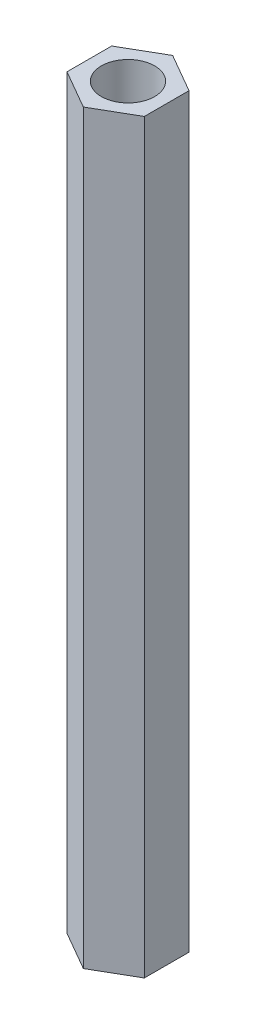
ISO-10303-21;
HEADER;
FILE_DESCRIPTION(('STEP AP214'),'2;1');
FILE_NAME('part.step','',(''),(''),'','','');
FILE_SCHEMA(('AUTOMOTIVE_DESIGN { 1 0 10303 214 1 1 1 1 }'));
ENDSEC;
DATA;
#1=APPLICATION_CONTEXT('core data for automotive mechanical design processes');
#2=APPLICATION_PROTOCOL_DEFINITION('international standard','automotive_design',2000,#1);
#3=PRODUCT_CONTEXT('',#1,'mechanical');
#4=PRODUCT('Part','Part','',(#3));
#5=PRODUCT_RELATED_PRODUCT_CATEGORY('part','',(#4));
#6=PRODUCT_DEFINITION_FORMATION('','',#4);
#7=PRODUCT_DEFINITION_CONTEXT('part definition',#1,'design');
#8=PRODUCT_DEFINITION('design','',#6,#7);
#9=PRODUCT_DEFINITION_SHAPE('','',#8);
#10=(LENGTH_UNIT() NAMED_UNIT(*) SI_UNIT(.MILLI.,.METRE.));
#11=(NAMED_UNIT(*) PLANE_ANGLE_UNIT() SI_UNIT($,.RADIAN.));
#12=(NAMED_UNIT(*) SI_UNIT($,.STERADIAN.) SOLID_ANGLE_UNIT());
#13=UNCERTAINTY_MEASURE_WITH_UNIT(LENGTH_MEASURE(1.E-05),#10,'distance_accuracy_value','');
#14=(GEOMETRIC_REPRESENTATION_CONTEXT(3) GLOBAL_UNCERTAINTY_ASSIGNED_CONTEXT((#13)) GLOBAL_UNIT_ASSIGNED_CONTEXT((#10,
#11,#12)) REPRESENTATION_CONTEXT('',''));
#15=CARTESIAN_POINT('',(0.,0.,0.));
#16=DIRECTION('',(0.,0.,1.));
#17=DIRECTION('',(1.,0.,0.));
#18=AXIS2_PLACEMENT_3D('',#15,#16,#17);
#19=CARTESIAN_POINT('',(0.,42.,0.));
#20=DIRECTION('',(0.,1.,0.));
#21=DIRECTION('',(0.,0.,1.));
#22=AXIS2_PLACEMENT_3D('',#19,#20,#21);
#23=PLANE('',#22);
#24=DIRECTION('',(-0.866025403784439,0.,-0.5));
#25=VECTOR('',#24,1.);
#26=CARTESIAN_POINT('',(2.1771024388365,42.,-1.25695067911564));
#27=LINE('',#26,#25);
#28=CARTESIAN_POINT('',(2.1771024388365,42.,-1.25695067911564));
#29=VERTEX_POINT('',#28);
#30=CARTESIAN_POINT('',(0.,42.,-2.51390135823129));
#31=VERTEX_POINT('',#30);
#32=EDGE_CURVE('E131',#29,#31,#27,.T.);
#33=ORIENTED_EDGE('',*,*,#32,.T.);
#34=DIRECTION('',(-0.866025403784439,0.,0.5));
#35=VECTOR('',#34,1.);
#36=CARTESIAN_POINT('',(0.,42.,-2.51390135823129));
#37=LINE('',#36,#35);
#38=CARTESIAN_POINT('',(-2.1771024388365,42.,-1.25695067911564));
#39=VERTEX_POINT('',#38);
#40=EDGE_CURVE('E89',#31,#39,#37,.T.);
#41=ORIENTED_EDGE('',*,*,#40,.T.);
#42=DIRECTION('',(0.,0.,1.));
#43=VECTOR('',#42,1.);
#44=CARTESIAN_POINT('',(-2.1771024388365,42.,-1.25695067911564));
#45=LINE('',#44,#43);
#46=CARTESIAN_POINT('',(-2.1771024388365,42.,1.25695067911564));
#47=VERTEX_POINT('',#46);
#48=EDGE_CURVE('E102',#39,#47,#45,.T.);
#49=ORIENTED_EDGE('',*,*,#48,.T.);
#50=DIRECTION('',(0.866025403784439,0.,0.5));
#51=VECTOR('',#50,1.);
#52=CARTESIAN_POINT('',(-2.1771024388365,42.,1.25695067911564));
#53=LINE('',#52,#51);
#54=CARTESIAN_POINT('',(0.,42.,2.51390135823129));
#55=VERTEX_POINT('',#54);
#56=EDGE_CURVE('E96',#47,#55,#53,.T.);
#57=ORIENTED_EDGE('',*,*,#56,.T.);
#58=DIRECTION('',(0.866025403784439,0.,-0.5));
#59=VECTOR('',#58,1.);
#60=CARTESIAN_POINT('',(0.,42.,2.51390135823129));
#61=LINE('',#60,#59);
#62=CARTESIAN_POINT('',(2.1771024388365,42.,1.25695067911564));
#63=VERTEX_POINT('',#62);
#64=EDGE_CURVE('E100',#55,#63,#61,.T.);
#65=ORIENTED_EDGE('',*,*,#64,.T.);
#66=DIRECTION('',(0.,0.,-1.));
#67=VECTOR('',#66,1.);
#68=CARTESIAN_POINT('',(2.1771024388365,42.,1.25695067911564));
#69=LINE('',#68,#67);
#70=EDGE_CURVE('E52',#63,#29,#69,.T.);
#71=ORIENTED_EDGE('',*,*,#70,.T.);
#72=EDGE_LOOP('',(#33,#41,#49,#57,#65,#71));
#73=FACE_BOUND('',#72,.T.);
#74=CARTESIAN_POINT('',(0.,42.,0.));
#75=DIRECTION('',(0.,1.,0.));
#76=DIRECTION('',(0.,0.,1.));
#77=AXIS2_PLACEMENT_3D('',#74,#75,#76);
#78=CIRCLE('',#77,1.5);
#79=CARTESIAN_POINT('',(0.,42.,-1.5));
#80=VERTEX_POINT('',#79);
#81=EDGE_CURVE('E124',#80,#80,#78,.T.);
#82=ORIENTED_EDGE('',*,*,#81,.F.);
#83=EDGE_LOOP('',(#82));
#84=FACE_BOUND('',#83,.T.);
#85=ADVANCED_FACE('F35',(#73,#84),#23,.T.);
#86=CARTESIAN_POINT('',(0.,0.,0.));
#87=DIRECTION('',(0.,1.,0.));
#88=DIRECTION('',(0.,0.,1.));
#89=AXIS2_PLACEMENT_3D('',#86,#87,#88);
#90=PLANE('',#89);
#91=DIRECTION('',(-0.866025403784439,0.,-0.5));
#92=VECTOR('',#91,1.);
#93=CARTESIAN_POINT('',(2.1771024388365,0.,-1.25695067911564));
#94=LINE('',#93,#92);
#95=CARTESIAN_POINT('',(2.1771024388365,0.,-1.25695067911564));
#96=VERTEX_POINT('',#95);
#97=CARTESIAN_POINT('',(0.,0.,-2.51390135823129));
#98=VERTEX_POINT('',#97);
#99=EDGE_CURVE('E120',#96,#98,#94,.T.);
#100=ORIENTED_EDGE('',*,*,#99,.F.);
#101=DIRECTION('',(0.,0.,-1.));
#102=VECTOR('',#101,1.);
#103=CARTESIAN_POINT('',(2.1771024388365,0.,1.25695067911564));
#104=LINE('',#103,#102);
#105=CARTESIAN_POINT('',(2.1771024388365,0.,1.25695067911564));
#106=VERTEX_POINT('',#105);
#107=EDGE_CURVE('E81',#106,#96,#104,.T.);
#108=ORIENTED_EDGE('',*,*,#107,.F.);
#109=DIRECTION('',(0.866025403784439,0.,-0.5));
#110=VECTOR('',#109,1.);
#111=CARTESIAN_POINT('',(0.,0.,2.51390135823129));
#112=LINE('',#111,#110);
#113=CARTESIAN_POINT('',(0.,0.,2.51390135823129));
#114=VERTEX_POINT('',#113);
#115=EDGE_CURVE('E75',#114,#106,#112,.T.);
#116=ORIENTED_EDGE('',*,*,#115,.F.);
#117=DIRECTION('',(0.866025403784439,0.,0.5));
#118=VECTOR('',#117,1.);
#119=CARTESIAN_POINT('',(-2.1771024388365,0.,1.25695067911564));
#120=LINE('',#119,#118);
#121=CARTESIAN_POINT('',(-2.1771024388365,0.,1.25695067911564));
#122=VERTEX_POINT('',#121);
#123=EDGE_CURVE('E110',#122,#114,#120,.T.);
#124=ORIENTED_EDGE('',*,*,#123,.F.);
#125=DIRECTION('',(0.,0.,1.));
#126=VECTOR('',#125,1.);
#127=CARTESIAN_POINT('',(-2.1771024388365,0.,-1.25695067911564));
#128=LINE('',#127,#126);
#129=CARTESIAN_POINT('',(-2.1771024388365,0.,-1.25695067911564));
#130=VERTEX_POINT('',#129);
#131=EDGE_CURVE('E126',#130,#122,#128,.T.);
#132=ORIENTED_EDGE('',*,*,#131,.F.);
#133=DIRECTION('',(-0.866025403784439,0.,0.5));
#134=VECTOR('',#133,1.);
#135=CARTESIAN_POINT('',(0.,0.,-2.51390135823129));
#136=LINE('',#135,#134);
#137=EDGE_CURVE('E123',#98,#130,#136,.T.);
#138=ORIENTED_EDGE('',*,*,#137,.F.);
#139=EDGE_LOOP('',(#100,#108,#116,#124,#132,#138));
#140=FACE_BOUND('',#139,.T.);
#141=CARTESIAN_POINT('',(0.,0.,0.));
#142=DIRECTION('',(0.,1.,0.));
#143=DIRECTION('',(0.,0.,1.));
#144=AXIS2_PLACEMENT_3D('',#141,#142,#143);
#145=CIRCLE('',#144,1.5);
#146=CARTESIAN_POINT('',(0.,0.,-1.5));
#147=VERTEX_POINT('',#146);
#148=EDGE_CURVE('E224',#147,#147,#145,.T.);
#149=ORIENTED_EDGE('',*,*,#148,.T.);
#150=EDGE_LOOP('',(#149));
#151=FACE_BOUND('',#150,.T.);
#152=ADVANCED_FACE('F140',(#140,#151),#90,.F.);
#153=CARTESIAN_POINT('',(2.1771024388365,42.,-1.25695067911564));
#154=DIRECTION('',(-0.5,0.,0.866025403784439));
#155=DIRECTION('',(0.866025403784439,0.,0.5));
#156=AXIS2_PLACEMENT_3D('',#153,#154,#155);
#157=PLANE('',#156);
#158=ORIENTED_EDGE('',*,*,#99,.T.);
#159=DIRECTION('',(0.,-1.,0.));
#160=VECTOR('',#159,1.);
#161=CARTESIAN_POINT('',(0.,42.,-2.51390135823129));
#162=LINE('',#161,#160);
#163=EDGE_CURVE('E11',#31,#98,#162,.T.);
#164=ORIENTED_EDGE('',*,*,#163,.F.);
#165=ORIENTED_EDGE('',*,*,#32,.F.);
#166=DIRECTION('',(0.,-1.,0.));
#167=VECTOR('',#166,1.);
#168=CARTESIAN_POINT('',(2.1771024388365,42.,-1.25695067911564));
#169=LINE('',#168,#167);
#170=EDGE_CURVE('E116',#29,#96,#169,.T.);
#171=ORIENTED_EDGE('',*,*,#170,.T.);
#172=EDGE_LOOP('',(#158,#164,#165,#171));
#173=FACE_BOUND('',#172,.T.);
#174=ADVANCED_FACE('F37',(#173),#157,.F.);
#175=CARTESIAN_POINT('',(0.,42.,-2.51390135823129));
#176=DIRECTION('',(0.5,0.,0.866025403784439));
#177=DIRECTION('',(0.866025403784439,0.,-0.5));
#178=AXIS2_PLACEMENT_3D('',#175,#176,#177);
#179=PLANE('',#178);
#180=ORIENTED_EDGE('',*,*,#137,.T.);
#181=DIRECTION('',(0.,-1.,0.));
#182=VECTOR('',#181,1.);
#183=CARTESIAN_POINT('',(-2.1771024388365,42.,-1.25695067911564));
#184=LINE('',#183,#182);
#185=EDGE_CURVE('E44',#39,#130,#184,.T.);
#186=ORIENTED_EDGE('',*,*,#185,.F.);
#187=ORIENTED_EDGE('',*,*,#40,.F.);
#188=ORIENTED_EDGE('',*,*,#163,.T.);
#189=EDGE_LOOP('',(#180,#186,#187,#188));
#190=FACE_BOUND('',#189,.T.);
#191=ADVANCED_FACE('F165',(#190),#179,.F.);
#192=CARTESIAN_POINT('',(-2.1771024388365,42.,-1.25695067911564));
#193=DIRECTION('',(1.,0.,0.));
#194=DIRECTION('',(0.,0.,-1.));
#195=AXIS2_PLACEMENT_3D('',#192,#193,#194);
#196=PLANE('',#195);
#197=ORIENTED_EDGE('',*,*,#131,.T.);
#198=DIRECTION('',(0.,-1.,0.));
#199=VECTOR('',#198,1.);
#200=CARTESIAN_POINT('',(-2.1771024388365,42.,1.25695067911564));
#201=LINE('',#200,#199);
#202=EDGE_CURVE('E111',#47,#122,#201,.T.);
#203=ORIENTED_EDGE('',*,*,#202,.F.);
#204=ORIENTED_EDGE('',*,*,#48,.F.);
#205=ORIENTED_EDGE('',*,*,#185,.T.);
#206=EDGE_LOOP('',(#197,#203,#204,#205));
#207=FACE_BOUND('',#206,.T.);
#208=ADVANCED_FACE('F137',(#207),#196,.F.);
#209=CARTESIAN_POINT('',(-2.1771024388365,42.,1.25695067911564));
#210=DIRECTION('',(0.5,0.,-0.866025403784439));
#211=DIRECTION('',(-0.866025403784439,0.,-0.5));
#212=AXIS2_PLACEMENT_3D('',#209,#210,#211);
#213=PLANE('',#212);
#214=ORIENTED_EDGE('',*,*,#123,.T.);
#215=DIRECTION('',(0.,-1.,0.));
#216=VECTOR('',#215,1.);
#217=CARTESIAN_POINT('',(0.,42.,2.51390135823129));
#218=LINE('',#217,#216);
#219=EDGE_CURVE('E107',#55,#114,#218,.T.);
#220=ORIENTED_EDGE('',*,*,#219,.F.);
#221=ORIENTED_EDGE('',*,*,#56,.F.);
#222=ORIENTED_EDGE('',*,*,#202,.T.);
#223=EDGE_LOOP('',(#214,#220,#221,#222));
#224=FACE_BOUND('',#223,.T.);
#225=ADVANCED_FACE('F108',(#224),#213,.F.);
#226=CARTESIAN_POINT('',(0.,42.,2.51390135823129));
#227=DIRECTION('',(-0.5,0.,-0.866025403784439));
#228=DIRECTION('',(-0.866025403784439,0.,0.5));
#229=AXIS2_PLACEMENT_3D('',#226,#227,#228);
#230=PLANE('',#229);
#231=ORIENTED_EDGE('',*,*,#115,.T.);
#232=DIRECTION('',(0.,-1.,0.));
#233=VECTOR('',#232,1.);
#234=CARTESIAN_POINT('',(2.1771024388365,42.,1.25695067911564));
#235=LINE('',#234,#233);
#236=EDGE_CURVE('E112',#63,#106,#235,.T.);
#237=ORIENTED_EDGE('',*,*,#236,.F.);
#238=ORIENTED_EDGE('',*,*,#64,.F.);
#239=ORIENTED_EDGE('',*,*,#219,.T.);
#240=EDGE_LOOP('',(#231,#237,#238,#239));
#241=FACE_BOUND('',#240,.T.);
#242=ADVANCED_FACE('F114',(#241),#230,.F.);
#243=CARTESIAN_POINT('',(2.1771024388365,42.,1.25695067911564));
#244=DIRECTION('',(-1.,0.,0.));
#245=DIRECTION('',(0.,0.,1.));
#246=AXIS2_PLACEMENT_3D('',#243,#244,#245);
#247=PLANE('',#246);
#248=ORIENTED_EDGE('',*,*,#107,.T.);
#249=ORIENTED_EDGE('',*,*,#170,.F.);
#250=ORIENTED_EDGE('',*,*,#70,.F.);
#251=ORIENTED_EDGE('',*,*,#236,.T.);
#252=EDGE_LOOP('',(#248,#249,#250,#251));
#253=FACE_BOUND('',#252,.T.);
#254=ADVANCED_FACE('F145',(#253),#247,.F.);
#255=CARTESIAN_POINT('',(0.,42.,0.));
#256=DIRECTION('',(0.,-1.,0.));
#257=DIRECTION('',(0.,0.,-1.));
#258=AXIS2_PLACEMENT_3D('',#255,#256,#257);
#259=CYLINDRICAL_SURFACE('',#258,1.5);
#260=CARTESIAN_POINT('',(0.,42.,-1.5));
#261=CARTESIAN_POINT('',(0.,41.5625,-1.5));
#262=CARTESIAN_POINT('',(0.,41.125,-1.5));
#263=CARTESIAN_POINT('',(0.,40.25,-1.5));
#264=CARTESIAN_POINT('',(0.,39.8125,-1.5));
#265=CARTESIAN_POINT('',(0.,38.9375,-1.5));
#266=CARTESIAN_POINT('',(0.,38.5,-1.5));
#267=CARTESIAN_POINT('',(0.,37.625,-1.5));
#268=CARTESIAN_POINT('',(0.,37.1875,-1.5));
#269=CARTESIAN_POINT('',(0.,36.3125,-1.5));
#270=CARTESIAN_POINT('',(0.,35.875,-1.5));
#271=CARTESIAN_POINT('',(0.,35.,-1.5));
#272=CARTESIAN_POINT('',(0.,34.5625,-1.5));
#273=CARTESIAN_POINT('',(0.,33.6875,-1.5));
#274=CARTESIAN_POINT('',(0.,33.25,-1.5));
#275=CARTESIAN_POINT('',(0.,32.375,-1.5));
#276=CARTESIAN_POINT('',(0.,31.9375,-1.5));
#277=CARTESIAN_POINT('',(0.,31.0625,-1.5));
#278=CARTESIAN_POINT('',(0.,30.625,-1.5));
#279=CARTESIAN_POINT('',(0.,29.75,-1.5));
#280=CARTESIAN_POINT('',(0.,29.3125,-1.5));
#281=CARTESIAN_POINT('',(0.,28.4375,-1.5));
#282=CARTESIAN_POINT('',(0.,28.,-1.5));
#283=CARTESIAN_POINT('',(0.,27.125,-1.5));
#284=CARTESIAN_POINT('',(0.,26.6875,-1.5));
#285=CARTESIAN_POINT('',(0.,25.8125,-1.5));
#286=CARTESIAN_POINT('',(0.,25.375,-1.5));
#287=CARTESIAN_POINT('',(0.,24.5,-1.5));
#288=CARTESIAN_POINT('',(0.,24.0625,-1.5));
#289=CARTESIAN_POINT('',(0.,23.1875,-1.5));
#290=CARTESIAN_POINT('',(0.,22.75,-1.5));
#291=CARTESIAN_POINT('',(0.,21.875,-1.5));
#292=CARTESIAN_POINT('',(0.,21.4375,-1.5));
#293=CARTESIAN_POINT('',(0.,20.5625,-1.5));
#294=CARTESIAN_POINT('',(0.,20.125,-1.5));
#295=CARTESIAN_POINT('',(0.,19.25,-1.5));
#296=CARTESIAN_POINT('',(0.,18.8125,-1.5));
#297=CARTESIAN_POINT('',(0.,17.9375,-1.5));
#298=CARTESIAN_POINT('',(0.,17.5,-1.5));
#299=CARTESIAN_POINT('',(0.,16.625,-1.5));
#300=CARTESIAN_POINT('',(0.,16.1875,-1.5));
#301=CARTESIAN_POINT('',(0.,15.3125,-1.5));
#302=CARTESIAN_POINT('',(0.,14.875,-1.5));
#303=CARTESIAN_POINT('',(0.,14.,-1.5));
#304=CARTESIAN_POINT('',(0.,13.5625,-1.5));
#305=CARTESIAN_POINT('',(0.,12.6875,-1.5));
#306=CARTESIAN_POINT('',(0.,12.25,-1.5));
#307=CARTESIAN_POINT('',(0.,11.375,-1.5));
#308=CARTESIAN_POINT('',(0.,10.9375,-1.5));
#309=CARTESIAN_POINT('',(0.,10.0625,-1.5));
#310=CARTESIAN_POINT('',(0.,9.625,-1.5));
#311=CARTESIAN_POINT('',(0.,8.75,-1.5));
#312=CARTESIAN_POINT('',(0.,8.3125,-1.5));
#313=CARTESIAN_POINT('',(0.,7.4375,-1.5));
#314=CARTESIAN_POINT('',(0.,7.,-1.5));
#315=CARTESIAN_POINT('',(0.,6.125,-1.5));
#316=CARTESIAN_POINT('',(0.,5.6875,-1.5));
#317=CARTESIAN_POINT('',(0.,4.8125,-1.5));
#318=CARTESIAN_POINT('',(0.,4.375,-1.5));
#319=CARTESIAN_POINT('',(0.,3.5,-1.5));
#320=CARTESIAN_POINT('',(0.,3.0625,-1.5));
#321=CARTESIAN_POINT('',(0.,2.1875,-1.5));
#322=CARTESIAN_POINT('',(0.,1.75,-1.5));
#323=CARTESIAN_POINT('',(0.,0.875000000000001,-1.5));
#324=CARTESIAN_POINT('',(0.,0.4375,-1.5));
#325=CARTESIAN_POINT('',(0.,0.,-1.5));
#326=B_SPLINE_CURVE_WITH_KNOTS('',3,(#260,#261,#262,#263,#264,#265,#266,#267,#268,#269,#270,
#271,#272,#273,#274,#275,#276,#277,#278,#279,#280,#281,#282,#283,#284,#285,#286,#287,#288,#289,
#290,#291,#292,#293,#294,#295,#296,#297,#298,#299,#300,#301,#302,#303,#304,#305,#306,#307,#308,
#309,#310,#311,#312,#313,#314,#315,#316,#317,#318,#319,#320,#321,#322,#323,#324,#325),
.UNSPECIFIED.,.F.,.F.,(4,2,2,2,2,2,2,2,2,2,2,2,2,2,2,2,2,2,2,2,2,2,2,2,2,2,2,2,2,2,2,2,4),(0.,
1.31249999999999,2.625,3.9375,5.25,6.5625,7.87499999999999,9.18749999999999,10.5,11.8125,13.125,
14.4375,15.75,17.0625,18.375,19.6875,21.,22.3125,23.625,24.9375,26.25,27.5625,28.875,30.1875,
31.5,32.8125,34.125,35.4375,36.75,38.0625,39.375,40.6875,42.),.UNSPECIFIED.);
#327=EDGE_CURVE('BSEAM147',#80,#147,#326,.T.);
#328=ORIENTED_EDGE('',*,*,#81,.T.);
#329=ORIENTED_EDGE('',*,*,#148,.F.);
#330=ORIENTED_EDGE('',*,*,#327,.T.);
#331=ORIENTED_EDGE('',*,*,#327,.F.);
#332=EDGE_LOOP('',(#328,#330,#329,#331));
#333=FACE_BOUND('',#332,.T.);
#334=ADVANCED_FACE('F147',(#333),#259,.F.);
#335=CLOSED_SHELL('',(#85,#152,#174,#191,#208,#225,#242,#254,#334));
#336=MANIFOLD_SOLID_BREP('B2',#335);
#337=ADVANCED_BREP_SHAPE_REPRESENTATION('',(#18,#336),#14);
#338=SHAPE_DEFINITION_REPRESENTATION(#9,#337);
ENDSEC;
END-ISO-10303-21;
